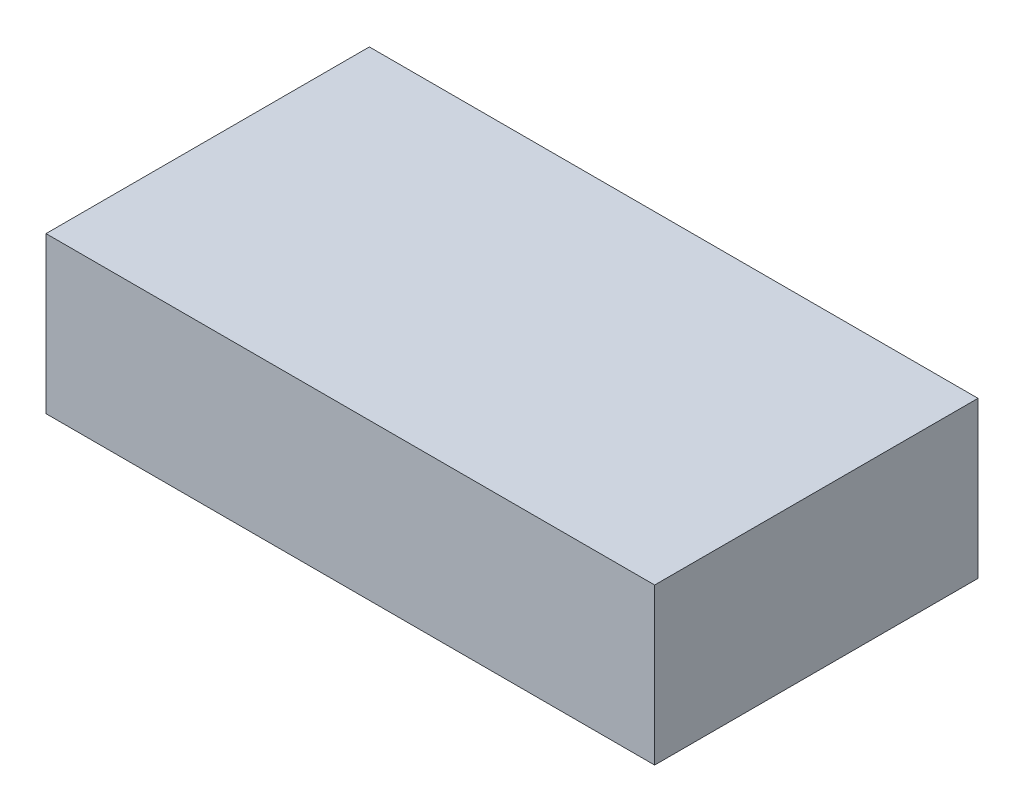
ISO-10303-21;
HEADER;
FILE_DESCRIPTION(('STEP AP214'),'2;1');
FILE_NAME('part.step','',(''),(''),'','','');
FILE_SCHEMA(('AUTOMOTIVE_DESIGN { 1 0 10303 214 1 1 1 1 }'));
ENDSEC;
DATA;
#1=APPLICATION_CONTEXT('core data for automotive mechanical design processes');
#2=APPLICATION_PROTOCOL_DEFINITION('international standard','automotive_design',2000,#1);
#3=PRODUCT_CONTEXT('',#1,'mechanical');
#4=PRODUCT('Part','Part','',(#3));
#5=PRODUCT_RELATED_PRODUCT_CATEGORY('part','',(#4));
#6=PRODUCT_DEFINITION_FORMATION('','',#4);
#7=PRODUCT_DEFINITION_CONTEXT('part definition',#1,'design');
#8=PRODUCT_DEFINITION('design','',#6,#7);
#9=PRODUCT_DEFINITION_SHAPE('','',#8);
#10=(LENGTH_UNIT() NAMED_UNIT(*) SI_UNIT(.MILLI.,.METRE.));
#11=(NAMED_UNIT(*) PLANE_ANGLE_UNIT() SI_UNIT($,.RADIAN.));
#12=(NAMED_UNIT(*) SI_UNIT($,.STERADIAN.) SOLID_ANGLE_UNIT());
#13=UNCERTAINTY_MEASURE_WITH_UNIT(LENGTH_MEASURE(1.E-05),#10,'distance_accuracy_value','');
#14=(GEOMETRIC_REPRESENTATION_CONTEXT(3) GLOBAL_UNCERTAINTY_ASSIGNED_CONTEXT((#13)) GLOBAL_UNIT_ASSIGNED_CONTEXT((#10,
#11,#12)) REPRESENTATION_CONTEXT('',''));
#15=CARTESIAN_POINT('',(0.,0.,0.));
#16=DIRECTION('',(0.,0.,1.));
#17=DIRECTION('',(1.,0.,0.));
#18=AXIS2_PLACEMENT_3D('',#15,#16,#17);
#19=CARTESIAN_POINT('',(0.,0.,0.));
#20=DIRECTION('',(0.,1.,0.));
#21=DIRECTION('',(1.,0.,0.));
#22=AXIS2_PLACEMENT_3D('',#19,#20,#21);
#23=PLANE('',#22);
#24=DIRECTION('',(-1.,0.,0.));
#25=VECTOR('',#24,1.);
#26=CARTESIAN_POINT('',(-0.8,0.,0.425));
#27=LINE('',#26,#25);
#28=CARTESIAN_POINT('',(0.8,0.,0.425));
#29=VERTEX_POINT('',#28);
#30=CARTESIAN_POINT('',(-0.8,0.,0.425));
#31=VERTEX_POINT('',#30);
#32=EDGE_CURVE('E78',#29,#31,#27,.T.);
#33=ORIENTED_EDGE('',*,*,#32,.T.);
#34=DIRECTION('',(0.,0.,-1.));
#35=VECTOR('',#34,1.);
#36=CARTESIAN_POINT('',(-0.8,0.,-0.425));
#37=LINE('',#36,#35);
#38=CARTESIAN_POINT('',(-0.8,0.,-0.425));
#39=VERTEX_POINT('',#38);
#40=EDGE_CURVE('E66',#31,#39,#37,.T.);
#41=ORIENTED_EDGE('',*,*,#40,.T.);
#42=DIRECTION('',(1.,0.,0.));
#43=VECTOR('',#42,1.);
#44=CARTESIAN_POINT('',(-0.8,0.,-0.425));
#45=LINE('',#44,#43);
#46=CARTESIAN_POINT('',(0.8,0.,-0.425));
#47=VERTEX_POINT('',#46);
#48=EDGE_CURVE('E27',#39,#47,#45,.T.);
#49=ORIENTED_EDGE('',*,*,#48,.T.);
#50=DIRECTION('',(0.,0.,1.));
#51=VECTOR('',#50,1.);
#52=CARTESIAN_POINT('',(0.8,0.,-0.425));
#53=LINE('',#52,#51);
#54=EDGE_CURVE('E11',#47,#29,#53,.T.);
#55=ORIENTED_EDGE('',*,*,#54,.T.);
#56=EDGE_LOOP('',(#33,#41,#49,#55));
#57=FACE_BOUND('',#56,.T.);
#58=ADVANCED_FACE('F16',(#57),#23,.F.);
#59=CARTESIAN_POINT('',(0.8,0.41,-0.425));
#60=DIRECTION('',(-1.,0.,0.));
#61=DIRECTION('',(0.,0.,1.));
#62=AXIS2_PLACEMENT_3D('',#59,#60,#61);
#63=PLANE('',#62);
#64=DIRECTION('',(0.,1.,0.));
#65=VECTOR('',#64,1.);
#66=CARTESIAN_POINT('',(0.8,0.41,-0.425));
#67=LINE('',#66,#65);
#68=CARTESIAN_POINT('',(0.8,0.41,-0.425));
#69=VERTEX_POINT('',#68);
#70=EDGE_CURVE('E75',#47,#69,#67,.T.);
#71=ORIENTED_EDGE('',*,*,#70,.T.);
#72=DIRECTION('',(0.,0.,-1.));
#73=VECTOR('',#72,1.);
#74=CARTESIAN_POINT('',(0.8,0.41,0.));
#75=LINE('',#74,#73);
#76=CARTESIAN_POINT('',(0.8,0.41,0.425));
#77=VERTEX_POINT('',#76);
#78=EDGE_CURVE('E99',#77,#69,#75,.T.);
#79=ORIENTED_EDGE('',*,*,#78,.F.);
#80=DIRECTION('',(0.,-1.,0.));
#81=VECTOR('',#80,1.);
#82=CARTESIAN_POINT('',(0.8,0.41,0.425));
#83=LINE('',#82,#81);
#84=EDGE_CURVE('E87',#77,#29,#83,.T.);
#85=ORIENTED_EDGE('',*,*,#84,.T.);
#86=ORIENTED_EDGE('',*,*,#54,.F.);
#87=EDGE_LOOP('',(#71,#79,#85,#86));
#88=FACE_BOUND('',#87,.T.);
#89=ADVANCED_FACE('F18',(#88),#63,.F.);
#90=CARTESIAN_POINT('',(-0.8,0.41,-0.425));
#91=DIRECTION('',(0.,0.,1.));
#92=DIRECTION('',(1.,0.,0.));
#93=AXIS2_PLACEMENT_3D('',#90,#91,#92);
#94=PLANE('',#93);
#95=DIRECTION('',(0.,1.,0.));
#96=VECTOR('',#95,1.);
#97=CARTESIAN_POINT('',(-0.8,0.41,-0.425));
#98=LINE('',#97,#96);
#99=CARTESIAN_POINT('',(-0.8,0.41,-0.425));
#100=VERTEX_POINT('',#99);
#101=EDGE_CURVE('E20',#39,#100,#98,.T.);
#102=ORIENTED_EDGE('',*,*,#101,.T.);
#103=DIRECTION('',(-1.,0.,0.));
#104=VECTOR('',#103,1.);
#105=CARTESIAN_POINT('',(0.,0.41,-0.425));
#106=LINE('',#105,#104);
#107=EDGE_CURVE('E93',#69,#100,#106,.T.);
#108=ORIENTED_EDGE('',*,*,#107,.F.);
#109=ORIENTED_EDGE('',*,*,#70,.F.);
#110=ORIENTED_EDGE('',*,*,#48,.F.);
#111=EDGE_LOOP('',(#102,#108,#109,#110));
#112=FACE_BOUND('',#111,.T.);
#113=ADVANCED_FACE('F114',(#112),#94,.F.);
#114=CARTESIAN_POINT('',(-0.8,0.41,-0.425));
#115=DIRECTION('',(1.,0.,0.));
#116=DIRECTION('',(0.,0.,-1.));
#117=AXIS2_PLACEMENT_3D('',#114,#115,#116);
#118=PLANE('',#117);
#119=DIRECTION('',(0.,1.,0.));
#120=VECTOR('',#119,1.);
#121=CARTESIAN_POINT('',(-0.8,0.41,0.425));
#122=LINE('',#121,#120);
#123=CARTESIAN_POINT('',(-0.8,0.41,0.425));
#124=VERTEX_POINT('',#123);
#125=EDGE_CURVE('E71',#31,#124,#122,.T.);
#126=ORIENTED_EDGE('',*,*,#125,.T.);
#127=DIRECTION('',(0.,0.,1.));
#128=VECTOR('',#127,1.);
#129=CARTESIAN_POINT('',(-0.8,0.41,0.));
#130=LINE('',#129,#128);
#131=EDGE_CURVE('E100',#100,#124,#130,.T.);
#132=ORIENTED_EDGE('',*,*,#131,.F.);
#133=ORIENTED_EDGE('',*,*,#101,.F.);
#134=ORIENTED_EDGE('',*,*,#40,.F.);
#135=EDGE_LOOP('',(#126,#132,#133,#134));
#136=FACE_BOUND('',#135,.T.);
#137=ADVANCED_FACE('F68',(#136),#118,.F.);
#138=CARTESIAN_POINT('',(-0.8,0.41,0.425));
#139=DIRECTION('',(0.,0.,-1.));
#140=DIRECTION('',(0.,-1.,0.));
#141=AXIS2_PLACEMENT_3D('',#138,#139,#140);
#142=PLANE('',#141);
#143=ORIENTED_EDGE('',*,*,#84,.F.);
#144=DIRECTION('',(1.,0.,0.));
#145=VECTOR('',#144,1.);
#146=CARTESIAN_POINT('',(0.,0.41,0.425));
#147=LINE('',#146,#145);
#148=EDGE_CURVE('E84',#124,#77,#147,.T.);
#149=ORIENTED_EDGE('',*,*,#148,.F.);
#150=ORIENTED_EDGE('',*,*,#125,.F.);
#151=ORIENTED_EDGE('',*,*,#32,.F.);
#152=EDGE_LOOP('',(#143,#149,#150,#151));
#153=FACE_BOUND('',#152,.T.);
#154=ADVANCED_FACE('F82',(#153),#142,.F.);
#155=CARTESIAN_POINT('',(0.,0.41,0.));
#156=DIRECTION('',(0.,1.,0.));
#157=DIRECTION('',(1.,0.,0.));
#158=AXIS2_PLACEMENT_3D('',#155,#156,#157);
#159=PLANE('',#158);
#160=ORIENTED_EDGE('',*,*,#131,.T.);
#161=ORIENTED_EDGE('',*,*,#148,.T.);
#162=ORIENTED_EDGE('',*,*,#78,.T.);
#163=ORIENTED_EDGE('',*,*,#107,.T.);
#164=EDGE_LOOP('',(#160,#161,#162,#163));
#165=FACE_BOUND('',#164,.T.);
#166=ADVANCED_FACE('F118',(#165),#159,.T.);
#167=CLOSED_SHELL('',(#58,#89,#113,#137,#154,#166));
#168=MANIFOLD_SOLID_BREP('B1',#167);
#169=ADVANCED_BREP_SHAPE_REPRESENTATION('',(#18,#168),#14);
#170=SHAPE_DEFINITION_REPRESENTATION(#9,#169);
ENDSEC;
END-ISO-10303-21;
